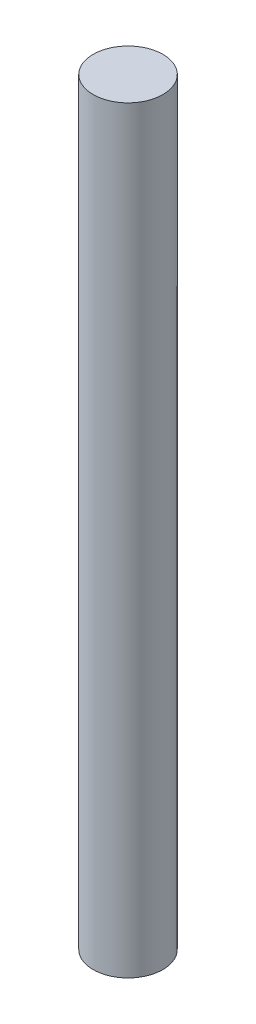
ISO-10303-21;
HEADER;
FILE_DESCRIPTION(('STEP AP214'),'2;1');
FILE_NAME('part.step','',(''),(''),'','','');
FILE_SCHEMA(('AUTOMOTIVE_DESIGN { 1 0 10303 214 1 1 1 1 }'));
ENDSEC;
DATA;
#1=APPLICATION_CONTEXT('core data for automotive mechanical design processes');
#2=APPLICATION_PROTOCOL_DEFINITION('international standard','automotive_design',2000,#1);
#3=PRODUCT_CONTEXT('',#1,'mechanical');
#4=PRODUCT('Part','Part','',(#3));
#5=PRODUCT_RELATED_PRODUCT_CATEGORY('part','',(#4));
#6=PRODUCT_DEFINITION_FORMATION('','',#4);
#7=PRODUCT_DEFINITION_CONTEXT('part definition',#1,'design');
#8=PRODUCT_DEFINITION('design','',#6,#7);
#9=PRODUCT_DEFINITION_SHAPE('','',#8);
#10=(LENGTH_UNIT() NAMED_UNIT(*) SI_UNIT(.MILLI.,.METRE.));
#11=(NAMED_UNIT(*) PLANE_ANGLE_UNIT() SI_UNIT($,.RADIAN.));
#12=(NAMED_UNIT(*) SI_UNIT($,.STERADIAN.) SOLID_ANGLE_UNIT());
#13=UNCERTAINTY_MEASURE_WITH_UNIT(LENGTH_MEASURE(1.E-05),#10,'distance_accuracy_value','');
#14=(GEOMETRIC_REPRESENTATION_CONTEXT(3) GLOBAL_UNCERTAINTY_ASSIGNED_CONTEXT((#13)) GLOBAL_UNIT_ASSIGNED_CONTEXT((#10,
#11,#12)) REPRESENTATION_CONTEXT('',''));
#15=CARTESIAN_POINT('',(0.,0.,0.));
#16=DIRECTION('',(0.,0.,1.));
#17=DIRECTION('',(1.,0.,0.));
#18=AXIS2_PLACEMENT_3D('',#15,#16,#17);
#19=CARTESIAN_POINT('',(0.,38.1,0.));
#20=DIRECTION('',(0.,-1.,0.));
#21=DIRECTION('',(0.,0.,-1.));
#22=AXIS2_PLACEMENT_3D('',#19,#20,#21);
#23=CYLINDRICAL_SURFACE('',#22,1.7526);
#24=CARTESIAN_POINT('',(0.,38.1,0.));
#25=DIRECTION('',(0.,1.,0.));
#26=DIRECTION('',(0.,0.,1.));
#27=AXIS2_PLACEMENT_3D('',#24,#25,#26);
#28=CIRCLE('',#27,1.7526);
#29=CARTESIAN_POINT('',(0.,38.1,-1.7526));
#30=VERTEX_POINT('',#29);
#31=EDGE_CURVE('E10',#30,#30,#28,.T.);
#32=CARTESIAN_POINT('',(0.,0.,0.));
#33=DIRECTION('',(0.,1.,0.));
#34=DIRECTION('',(0.,0.,1.));
#35=AXIS2_PLACEMENT_3D('',#32,#33,#34);
#36=CIRCLE('',#35,1.7526);
#37=CARTESIAN_POINT('',(0.,0.,-1.7526));
#38=VERTEX_POINT('',#37);
#39=EDGE_CURVE('E44',#38,#38,#36,.T.);
#40=CARTESIAN_POINT('',(0.,38.1,-1.7526));
#41=CARTESIAN_POINT('',(0.,37.703125,-1.7526));
#42=CARTESIAN_POINT('',(0.,37.30625,-1.7526));
#43=CARTESIAN_POINT('',(0.,36.5125,-1.7526));
#44=CARTESIAN_POINT('',(0.,36.115625,-1.7526));
#45=CARTESIAN_POINT('',(0.,35.321875,-1.7526));
#46=CARTESIAN_POINT('',(0.,34.925,-1.7526));
#47=CARTESIAN_POINT('',(0.,34.13125,-1.7526));
#48=CARTESIAN_POINT('',(0.,33.734375,-1.7526));
#49=CARTESIAN_POINT('',(0.,32.940625,-1.7526));
#50=CARTESIAN_POINT('',(0.,32.54375,-1.7526));
#51=CARTESIAN_POINT('',(0.,31.75,-1.7526));
#52=CARTESIAN_POINT('',(0.,31.353125,-1.7526));
#53=CARTESIAN_POINT('',(0.,30.559375,-1.7526));
#54=CARTESIAN_POINT('',(0.,30.1625,-1.7526));
#55=CARTESIAN_POINT('',(0.,29.36875,-1.7526));
#56=CARTESIAN_POINT('',(0.,28.971875,-1.7526));
#57=CARTESIAN_POINT('',(0.,28.178125,-1.7526));
#58=CARTESIAN_POINT('',(0.,27.78125,-1.7526));
#59=CARTESIAN_POINT('',(0.,26.9875,-1.7526));
#60=CARTESIAN_POINT('',(0.,26.590625,-1.7526));
#61=CARTESIAN_POINT('',(0.,25.796875,-1.7526));
#62=CARTESIAN_POINT('',(0.,25.4,-1.7526));
#63=CARTESIAN_POINT('',(0.,24.60625,-1.7526));
#64=CARTESIAN_POINT('',(0.,24.209375,-1.7526));
#65=CARTESIAN_POINT('',(0.,23.415625,-1.7526));
#66=CARTESIAN_POINT('',(0.,23.01875,-1.7526));
#67=CARTESIAN_POINT('',(0.,22.225,-1.7526));
#68=CARTESIAN_POINT('',(0.,21.828125,-1.7526));
#69=CARTESIAN_POINT('',(0.,21.034375,-1.7526));
#70=CARTESIAN_POINT('',(0.,20.6375,-1.7526));
#71=CARTESIAN_POINT('',(0.,19.84375,-1.7526));
#72=CARTESIAN_POINT('',(0.,19.446875,-1.7526));
#73=CARTESIAN_POINT('',(0.,18.653125,-1.7526));
#74=CARTESIAN_POINT('',(0.,18.25625,-1.7526));
#75=CARTESIAN_POINT('',(0.,17.4625,-1.7526));
#76=CARTESIAN_POINT('',(0.,17.065625,-1.7526));
#77=CARTESIAN_POINT('',(0.,16.271875,-1.7526));
#78=CARTESIAN_POINT('',(0.,15.875,-1.7526));
#79=CARTESIAN_POINT('',(0.,15.08125,-1.7526));
#80=CARTESIAN_POINT('',(0.,14.684375,-1.7526));
#81=CARTESIAN_POINT('',(0.,13.890625,-1.7526));
#82=CARTESIAN_POINT('',(0.,13.49375,-1.7526));
#83=CARTESIAN_POINT('',(0.,12.7,-1.7526));
#84=CARTESIAN_POINT('',(0.,12.303125,-1.7526));
#85=CARTESIAN_POINT('',(0.,11.509375,-1.7526));
#86=CARTESIAN_POINT('',(0.,11.1125,-1.7526));
#87=CARTESIAN_POINT('',(0.,10.31875,-1.7526));
#88=CARTESIAN_POINT('',(0.,9.921875,-1.7526));
#89=CARTESIAN_POINT('',(0.,9.128125,-1.7526));
#90=CARTESIAN_POINT('',(0.,8.73125,-1.7526));
#91=CARTESIAN_POINT('',(0.,7.9375,-1.7526));
#92=CARTESIAN_POINT('',(0.,7.540625,-1.7526));
#93=CARTESIAN_POINT('',(0.,6.746875,-1.7526));
#94=CARTESIAN_POINT('',(0.,6.35,-1.7526));
#95=CARTESIAN_POINT('',(0.,5.55625,-1.7526));
#96=CARTESIAN_POINT('',(0.,5.159375,-1.7526));
#97=CARTESIAN_POINT('',(0.,4.365625,-1.7526));
#98=CARTESIAN_POINT('',(0.,3.96875,-1.7526));
#99=CARTESIAN_POINT('',(0.,3.175,-1.7526));
#100=CARTESIAN_POINT('',(0.,2.778125,-1.7526));
#101=CARTESIAN_POINT('',(0.,1.984375,-1.7526));
#102=CARTESIAN_POINT('',(0.,1.5875,-1.7526));
#103=CARTESIAN_POINT('',(0.,0.79375,-1.7526));
#104=CARTESIAN_POINT('',(0.,0.396875,-1.7526));
#105=CARTESIAN_POINT('',(0.,0.,-1.7526));
#106=B_SPLINE_CURVE_WITH_KNOTS('',3,(#40,#41,#42,#43,#44,#45,#46,#47,#48,#49,#50,#51,#52,#53,
#54,#55,#56,#57,#58,#59,#60,#61,#62,#63,#64,#65,#66,#67,#68,#69,#70,#71,#72,#73,#74,#75,#76,#77,
#78,#79,#80,#81,#82,#83,#84,#85,#86,#87,#88,#89,#90,#91,#92,#93,#94,#95,#96,#97,#98,#99,#100,
#101,#102,#103,#104,#105),.UNSPECIFIED.,.F.,.F.,(4,2,2,2,2,2,2,2,2,2,2,2,2,2,2,2,2,2,2,2,2,2,2,
2,2,2,2,2,2,2,2,2,4),(0.,1.19062499999999,2.38124999999999,3.571875,4.7625,5.953125,7.14375,
8.33437499999999,9.525,10.715625,11.90625,13.096875,14.2875,15.478125,16.66875,17.859375,19.05,
20.240625,21.43125,22.621875,23.8125,25.003125,26.19375,27.384375,28.575,29.765625,30.95625,
32.146875,33.3375,34.528125,35.71875,36.909375,38.1),.UNSPECIFIED.);
#107=EDGE_CURVE('BSEAM41',#30,#38,#106,.T.);
#108=ORIENTED_EDGE('',*,*,#31,.F.);
#109=ORIENTED_EDGE('',*,*,#39,.T.);
#110=ORIENTED_EDGE('',*,*,#107,.T.);
#111=ORIENTED_EDGE('',*,*,#107,.F.);
#112=EDGE_LOOP('',(#108,#110,#109,#111));
#113=FACE_BOUND('',#112,.T.);
#114=ADVANCED_FACE('F41',(#113),#23,.T.);
#115=CARTESIAN_POINT('',(0.,38.1,0.));
#116=DIRECTION('',(0.,1.,0.));
#117=DIRECTION('',(0.,0.,1.));
#118=AXIS2_PLACEMENT_3D('',#115,#116,#117);
#119=PLANE('',#118);
#120=ORIENTED_EDGE('',*,*,#31,.T.);
#121=EDGE_LOOP('',(#120));
#122=FACE_BOUND('',#121,.T.);
#123=ADVANCED_FACE('F58',(#122),#119,.T.);
#124=CARTESIAN_POINT('',(0.,0.,0.));
#125=DIRECTION('',(0.,1.,0.));
#126=DIRECTION('',(0.,0.,1.));
#127=AXIS2_PLACEMENT_3D('',#124,#125,#126);
#128=PLANE('',#127);
#129=ORIENTED_EDGE('',*,*,#39,.F.);
#130=EDGE_LOOP('',(#129));
#131=FACE_BOUND('',#130,.T.);
#132=ADVANCED_FACE('F56',(#131),#128,.F.);
#133=CLOSED_SHELL('',(#114,#123,#132));
#134=MANIFOLD_SOLID_BREP('B2',#133);
#135=ADVANCED_BREP_SHAPE_REPRESENTATION('',(#18,#134),#14);
#136=SHAPE_DEFINITION_REPRESENTATION(#9,#135);
ENDSEC;
END-ISO-10303-21;
